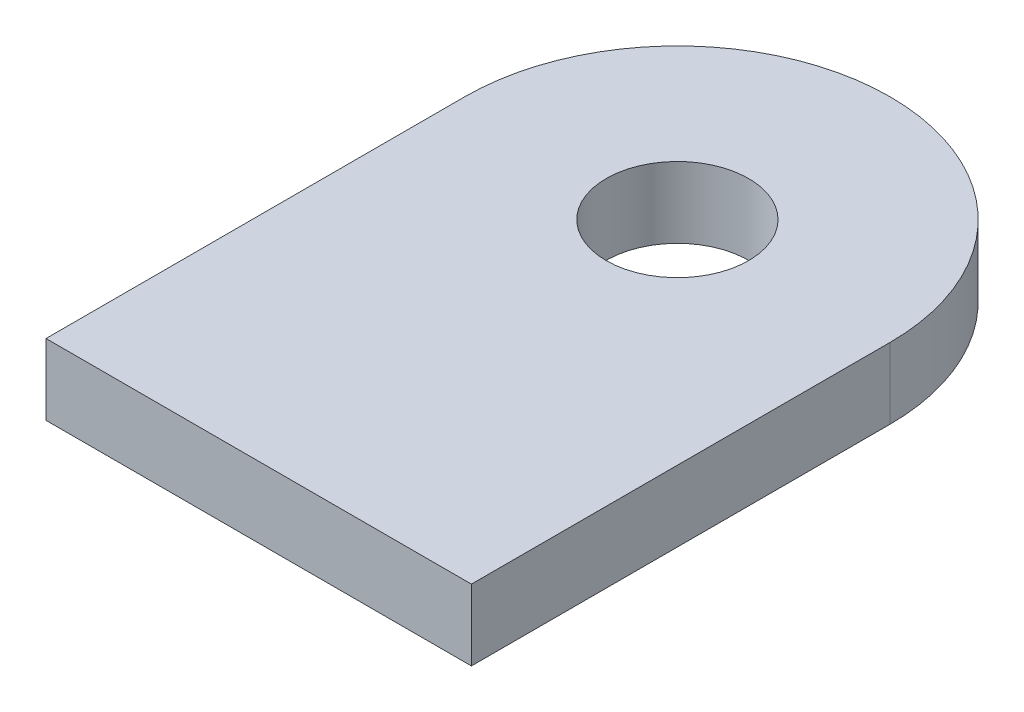
ISO-10303-21;
HEADER;
FILE_DESCRIPTION(('STEP AP214'),'2;1');
FILE_NAME('part.step','',(''),(''),'','','');
FILE_SCHEMA(('AUTOMOTIVE_DESIGN { 1 0 10303 214 1 1 1 1 }'));
ENDSEC;
DATA;
#1=APPLICATION_CONTEXT('core data for automotive mechanical design processes');
#2=APPLICATION_PROTOCOL_DEFINITION('international standard','automotive_design',2000,#1);
#3=PRODUCT_CONTEXT('',#1,'mechanical');
#4=PRODUCT('Part','Part','',(#3));
#5=PRODUCT_RELATED_PRODUCT_CATEGORY('part','',(#4));
#6=PRODUCT_DEFINITION_FORMATION('','',#4);
#7=PRODUCT_DEFINITION_CONTEXT('part definition',#1,'design');
#8=PRODUCT_DEFINITION('design','',#6,#7);
#9=PRODUCT_DEFINITION_SHAPE('','',#8);
#10=(LENGTH_UNIT() NAMED_UNIT(*) SI_UNIT(.MILLI.,.METRE.));
#11=(NAMED_UNIT(*) PLANE_ANGLE_UNIT() SI_UNIT($,.RADIAN.));
#12=(NAMED_UNIT(*) SI_UNIT($,.STERADIAN.) SOLID_ANGLE_UNIT());
#13=UNCERTAINTY_MEASURE_WITH_UNIT(LENGTH_MEASURE(1.E-05),#10,'distance_accuracy_value','');
#14=(GEOMETRIC_REPRESENTATION_CONTEXT(3) GLOBAL_UNCERTAINTY_ASSIGNED_CONTEXT((#13)) GLOBAL_UNIT_ASSIGNED_CONTEXT((#10,
#11,#12)) REPRESENTATION_CONTEXT('',''));
#15=CARTESIAN_POINT('',(0.,0.,0.));
#16=DIRECTION('',(0.,0.,1.));
#17=DIRECTION('',(1.,0.,0.));
#18=AXIS2_PLACEMENT_3D('',#15,#16,#17);
#19=CARTESIAN_POINT('',(12.7,4.23333333333333,-25.));
#20=DIRECTION('',(0.,-1.,0.));
#21=DIRECTION('',(0.,0.,-1.));
#22=AXIS2_PLACEMENT_3D('',#19,#20,#21);
#23=CYLINDRICAL_SURFACE('',#22,12.7);
#24=CARTESIAN_POINT('',(12.7,0.,-25.));
#25=DIRECTION('',(0.,1.,0.));
#26=DIRECTION('',(0.,0.,1.));
#27=AXIS2_PLACEMENT_3D('',#24,#25,#26);
#28=CIRCLE('',#27,12.7);
#29=CARTESIAN_POINT('',(0.,0.,-25.));
#30=VERTEX_POINT('',#29);
#31=CARTESIAN_POINT('',(25.4,0.,-25.));
#32=VERTEX_POINT('',#31);
#33=EDGE_CURVE('E121',#30,#32,#28,.F.);
#34=ORIENTED_EDGE('',*,*,#33,.F.);
#35=DIRECTION('',(0.,-1.,0.));
#36=VECTOR('',#35,1.);
#37=CARTESIAN_POINT('',(0.,4.23333333333333,-25.));
#38=LINE('',#37,#36);
#39=CARTESIAN_POINT('',(0.,4.23333333333333,-25.));
#40=VERTEX_POINT('',#39);
#41=EDGE_CURVE('E11',#40,#30,#38,.T.);
#42=ORIENTED_EDGE('',*,*,#41,.F.);
#43=CARTESIAN_POINT('',(12.7,4.23333333333333,-25.));
#44=DIRECTION('',(0.,1.,0.));
#45=DIRECTION('',(0.,0.,1.));
#46=AXIS2_PLACEMENT_3D('',#43,#44,#45);
#47=CIRCLE('',#46,12.7);
#48=CARTESIAN_POINT('',(25.4,4.23333333333333,-25.));
#49=VERTEX_POINT('',#48);
#50=EDGE_CURVE('E107',#40,#49,#47,.F.);
#51=ORIENTED_EDGE('',*,*,#50,.T.);
#52=DIRECTION('',(0.,-1.,0.));
#53=VECTOR('',#52,1.);
#54=CARTESIAN_POINT('',(25.4,4.23333333333333,-25.));
#55=LINE('',#54,#53);
#56=EDGE_CURVE('E84',#49,#32,#55,.T.);
#57=ORIENTED_EDGE('',*,*,#56,.T.);
#58=EDGE_LOOP('',(#34,#42,#51,#57));
#59=FACE_BOUND('',#58,.T.);
#60=ADVANCED_FACE('F43',(#59),#23,.T.);
#61=CARTESIAN_POINT('',(0.,4.23333333333333,0.));
#62=DIRECTION('',(-1.,0.,0.));
#63=DIRECTION('',(0.,0.,1.));
#64=AXIS2_PLACEMENT_3D('',#61,#62,#63);
#65=PLANE('',#64);
#66=DIRECTION('',(0.,0.,-1.));
#67=VECTOR('',#66,1.);
#68=CARTESIAN_POINT('',(0.,0.,0.));
#69=LINE('',#68,#67);
#70=CARTESIAN_POINT('',(0.,0.,0.));
#71=VERTEX_POINT('',#70);
#72=EDGE_CURVE('E96',#71,#30,#69,.T.);
#73=ORIENTED_EDGE('',*,*,#72,.F.);
#74=DIRECTION('',(0.,-1.,0.));
#75=VECTOR('',#74,1.);
#76=CARTESIAN_POINT('',(0.,4.23333333333333,0.));
#77=LINE('',#76,#75);
#78=CARTESIAN_POINT('',(0.,4.23333333333333,0.));
#79=VERTEX_POINT('',#78);
#80=EDGE_CURVE('E53',#79,#71,#77,.T.);
#81=ORIENTED_EDGE('',*,*,#80,.F.);
#82=DIRECTION('',(0.,0.,-1.));
#83=VECTOR('',#82,1.);
#84=CARTESIAN_POINT('',(0.,4.23333333333333,0.));
#85=LINE('',#84,#83);
#86=EDGE_CURVE('E94',#79,#40,#85,.T.);
#87=ORIENTED_EDGE('',*,*,#86,.T.);
#88=ORIENTED_EDGE('',*,*,#41,.T.);
#89=EDGE_LOOP('',(#73,#81,#87,#88));
#90=FACE_BOUND('',#89,.T.);
#91=ADVANCED_FACE('F92',(#90),#65,.T.);
#92=CARTESIAN_POINT('',(0.,4.23333333333333,0.));
#93=DIRECTION('',(0.,0.,-1.));
#94=DIRECTION('',(-1.,0.,0.));
#95=AXIS2_PLACEMENT_3D('',#92,#93,#94);
#96=PLANE('',#95);
#97=DIRECTION('',(1.,0.,0.));
#98=VECTOR('',#97,1.);
#99=CARTESIAN_POINT('',(0.,0.,0.));
#100=LINE('',#99,#98);
#101=CARTESIAN_POINT('',(25.4,0.,0.));
#102=VERTEX_POINT('',#101);
#103=EDGE_CURVE('E126',#71,#102,#100,.T.);
#104=ORIENTED_EDGE('',*,*,#103,.T.);
#105=DIRECTION('',(0.,-1.,0.));
#106=VECTOR('',#105,1.);
#107=CARTESIAN_POINT('',(25.4,4.23333333333333,0.));
#108=LINE('',#107,#106);
#109=CARTESIAN_POINT('',(25.4,4.23333333333333,0.));
#110=VERTEX_POINT('',#109);
#111=EDGE_CURVE('E100',#110,#102,#108,.T.);
#112=ORIENTED_EDGE('',*,*,#111,.F.);
#113=DIRECTION('',(1.,0.,0.));
#114=VECTOR('',#113,1.);
#115=CARTESIAN_POINT('',(0.,4.23333333333333,0.));
#116=LINE('',#115,#114);
#117=EDGE_CURVE('E102',#79,#110,#116,.T.);
#118=ORIENTED_EDGE('',*,*,#117,.F.);
#119=ORIENTED_EDGE('',*,*,#80,.T.);
#120=EDGE_LOOP('',(#104,#112,#118,#119));
#121=FACE_BOUND('',#120,.T.);
#122=ADVANCED_FACE('F103',(#121),#96,.F.);
#123=CARTESIAN_POINT('',(12.7,4.23333333333333,-25.));
#124=DIRECTION('',(0.,-1.,0.));
#125=DIRECTION('',(0.,0.,-1.));
#126=AXIS2_PLACEMENT_3D('',#123,#124,#125);
#127=CYLINDRICAL_SURFACE('',#126,4.24999999999999);
#128=CARTESIAN_POINT('',(12.7,4.23333333333333,-25.));
#129=DIRECTION('',(0.,1.,0.));
#130=DIRECTION('',(0.,0.,1.));
#131=AXIS2_PLACEMENT_3D('',#128,#129,#130);
#132=CIRCLE('',#131,4.24999999999999);
#133=CARTESIAN_POINT('',(12.7,4.23333333333333,-20.75));
#134=VERTEX_POINT('',#133);
#135=EDGE_CURVE('E111',#134,#134,#132,.T.);
#136=ORIENTED_EDGE('',*,*,#135,.T.);
#137=EDGE_LOOP('',(#136));
#138=FACE_BOUND('',#137,.T.);
#139=CARTESIAN_POINT('',(12.7,0.,-25.));
#140=DIRECTION('',(0.,1.,0.));
#141=DIRECTION('',(0.,0.,1.));
#142=AXIS2_PLACEMENT_3D('',#139,#140,#141);
#143=CIRCLE('',#142,4.24999999999999);
#144=CARTESIAN_POINT('',(12.7,0.,-20.75));
#145=VERTEX_POINT('',#144);
#146=EDGE_CURVE('E117',#145,#145,#143,.T.);
#147=ORIENTED_EDGE('',*,*,#146,.F.);
#148=EDGE_LOOP('',(#147));
#149=FACE_BOUND('',#148,.T.);
#150=ADVANCED_FACE('F45',(#138,#149),#127,.F.);
#151=CARTESIAN_POINT('',(25.4,4.23333333333333,0.));
#152=DIRECTION('',(-1.,0.,0.));
#153=DIRECTION('',(0.,0.,1.));
#154=AXIS2_PLACEMENT_3D('',#151,#152,#153);
#155=PLANE('',#154);
#156=DIRECTION('',(0.,0.,-1.));
#157=VECTOR('',#156,1.);
#158=CARTESIAN_POINT('',(25.4,0.,0.));
#159=LINE('',#158,#157);
#160=EDGE_CURVE('E77',#102,#32,#159,.T.);
#161=ORIENTED_EDGE('',*,*,#160,.T.);
#162=ORIENTED_EDGE('',*,*,#56,.F.);
#163=DIRECTION('',(0.,0.,-1.));
#164=VECTOR('',#163,1.);
#165=CARTESIAN_POINT('',(25.4,4.23333333333333,0.));
#166=LINE('',#165,#164);
#167=EDGE_CURVE('E61',#110,#49,#166,.T.);
#168=ORIENTED_EDGE('',*,*,#167,.F.);
#169=ORIENTED_EDGE('',*,*,#111,.T.);
#170=EDGE_LOOP('',(#161,#162,#168,#169));
#171=FACE_BOUND('',#170,.T.);
#172=ADVANCED_FACE('F135',(#171),#155,.F.);
#173=CARTESIAN_POINT('',(0.,4.23333333333333,0.));
#174=DIRECTION('',(0.,1.,0.));
#175=DIRECTION('',(0.,0.,1.));
#176=AXIS2_PLACEMENT_3D('',#173,#174,#175);
#177=PLANE('',#176);
#178=ORIENTED_EDGE('',*,*,#135,.F.);
#179=EDGE_LOOP('',(#178));
#180=FACE_BOUND('',#179,.T.);
#181=ORIENTED_EDGE('',*,*,#50,.F.);
#182=ORIENTED_EDGE('',*,*,#86,.F.);
#183=ORIENTED_EDGE('',*,*,#117,.T.);
#184=ORIENTED_EDGE('',*,*,#167,.T.);
#185=EDGE_LOOP('',(#181,#182,#183,#184));
#186=FACE_BOUND('',#185,.T.);
#187=ADVANCED_FACE('F106',(#180,#186),#177,.T.);
#188=CARTESIAN_POINT('',(0.,0.,0.));
#189=DIRECTION('',(0.,1.,0.));
#190=DIRECTION('',(0.,0.,1.));
#191=AXIS2_PLACEMENT_3D('',#188,#189,#190);
#192=PLANE('',#191);
#193=ORIENTED_EDGE('',*,*,#146,.T.);
#194=EDGE_LOOP('',(#193));
#195=FACE_BOUND('',#194,.T.);
#196=ORIENTED_EDGE('',*,*,#33,.T.);
#197=ORIENTED_EDGE('',*,*,#160,.F.);
#198=ORIENTED_EDGE('',*,*,#103,.F.);
#199=ORIENTED_EDGE('',*,*,#72,.T.);
#200=EDGE_LOOP('',(#196,#197,#198,#199));
#201=FACE_BOUND('',#200,.T.);
#202=ADVANCED_FACE('F136',(#195,#201),#192,.F.);
#203=CLOSED_SHELL('',(#60,#91,#122,#150,#172,#187,#202));
#204=MANIFOLD_SOLID_BREP('B2',#203);
#205=ADVANCED_BREP_SHAPE_REPRESENTATION('',(#18,#204),#14);
#206=SHAPE_DEFINITION_REPRESENTATION(#9,#205);
ENDSEC;
END-ISO-10303-21;
